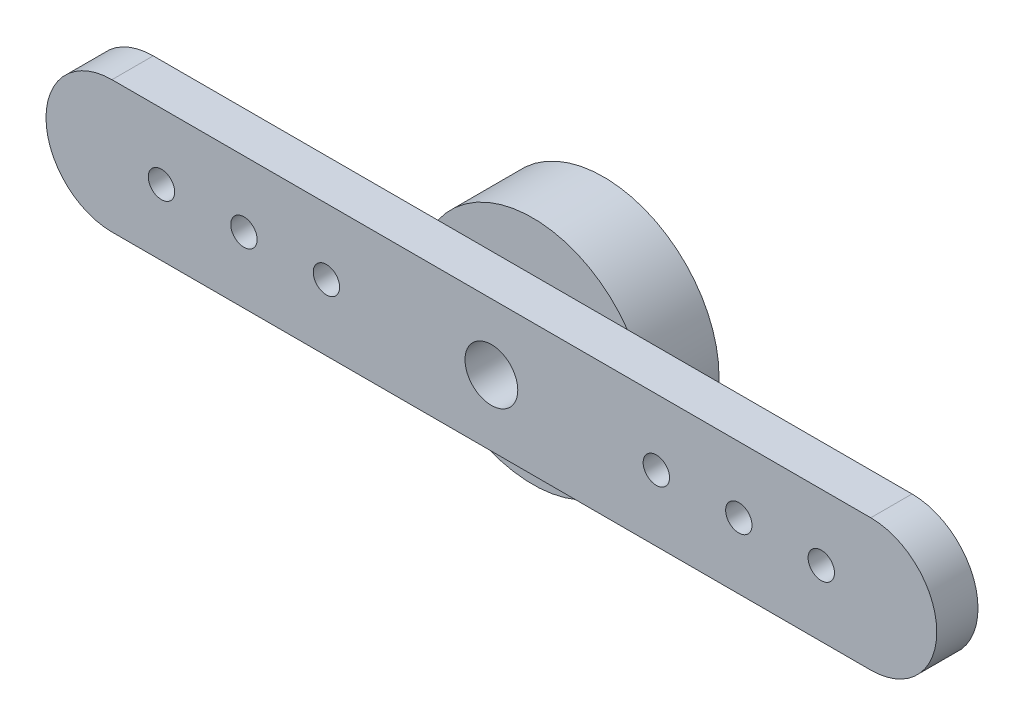
ISO-10303-21;
HEADER;
FILE_DESCRIPTION(('STEP AP214'),'2;1');
FILE_NAME('part.step','',(''),(''),'','','');
FILE_SCHEMA(('AUTOMOTIVE_DESIGN { 1 0 10303 214 1 1 1 1 }'));
ENDSEC;
DATA;
#1=APPLICATION_CONTEXT('core data for automotive mechanical design processes');
#2=APPLICATION_PROTOCOL_DEFINITION('international standard','automotive_design',2000,#1);
#3=PRODUCT_CONTEXT('',#1,'mechanical');
#4=PRODUCT('Part','Part','',(#3));
#5=PRODUCT_RELATED_PRODUCT_CATEGORY('part','',(#4));
#6=PRODUCT_DEFINITION_FORMATION('','',#4);
#7=PRODUCT_DEFINITION_CONTEXT('part definition',#1,'design');
#8=PRODUCT_DEFINITION('design','',#6,#7);
#9=PRODUCT_DEFINITION_SHAPE('','',#8);
#10=(LENGTH_UNIT() NAMED_UNIT(*) SI_UNIT(.MILLI.,.METRE.));
#11=(NAMED_UNIT(*) PLANE_ANGLE_UNIT() SI_UNIT($,.RADIAN.));
#12=(NAMED_UNIT(*) SI_UNIT($,.STERADIAN.) SOLID_ANGLE_UNIT());
#13=UNCERTAINTY_MEASURE_WITH_UNIT(LENGTH_MEASURE(1.E-05),#10,'distance_accuracy_value','');
#14=(GEOMETRIC_REPRESENTATION_CONTEXT(3) GLOBAL_UNCERTAINTY_ASSIGNED_CONTEXT((#13)) GLOBAL_UNIT_ASSIGNED_CONTEXT((#10,
#11,#12)) REPRESENTATION_CONTEXT('',''));
#15=CARTESIAN_POINT('',(0.,0.,0.));
#16=DIRECTION('',(0.,0.,1.));
#17=DIRECTION('',(1.,0.,0.));
#18=AXIS2_PLACEMENT_3D('',#15,#16,#17);
#19=CARTESIAN_POINT('',(0.,0.,6.5));
#20=DIRECTION('',(0.,0.,1.));
#21=DIRECTION('',(1.,0.,0.));
#22=AXIS2_PLACEMENT_3D('',#19,#20,#21);
#23=PLANE('',#22);
#24=DIRECTION('',(-1.,0.,0.));
#25=VECTOR('',#24,1.);
#26=CARTESIAN_POINT('',(-23.,4.,6.5));
#27=LINE('',#26,#25);
#28=CARTESIAN_POINT('',(5.74456264653803,4.,6.5));
#29=VERTEX_POINT('',#28);
#30=CARTESIAN_POINT('',(-5.74456264653803,4.,6.5));
#31=VERTEX_POINT('',#30);
#32=EDGE_CURVE('E11',#29,#31,#27,.T.);
#33=ORIENTED_EDGE('',*,*,#32,.F.);
#34=CARTESIAN_POINT('',(0.,0.,6.5));
#35=DIRECTION('',(0.,0.,1.));
#36=DIRECTION('',(1.,0.,0.));
#37=AXIS2_PLACEMENT_3D('',#34,#35,#36);
#38=CIRCLE('',#37,7.);
#39=EDGE_CURVE('E135',#29,#31,#38,.T.);
#40=ORIENTED_EDGE('',*,*,#39,.T.);
#41=EDGE_LOOP('',(#33,#40));
#42=FACE_BOUND('',#41,.T.);
#43=ADVANCED_FACE('F39',(#42),#23,.T.);
#44=DIRECTION('',(1.,0.,0.));
#45=VECTOR('',#44,1.);
#46=CARTESIAN_POINT('',(23.,-4.,6.5));
#47=LINE('',#46,#45);
#48=CARTESIAN_POINT('',(-5.74456264653803,-4.,6.5));
#49=VERTEX_POINT('',#48);
#50=CARTESIAN_POINT('',(5.74456264653803,-4.,6.5));
#51=VERTEX_POINT('',#50);
#52=EDGE_CURVE('E48',#49,#51,#47,.T.);
#53=ORIENTED_EDGE('',*,*,#52,.F.);
#54=EDGE_CURVE('E137',#49,#51,#38,.T.);
#55=ORIENTED_EDGE('',*,*,#54,.T.);
#56=EDGE_LOOP('',(#53,#55));
#57=FACE_BOUND('',#56,.T.);
#58=ADVANCED_FACE('F151',(#57),#23,.T.);
#59=CARTESIAN_POINT('',(0.,0.,2.2));
#60=DIRECTION('',(0.,0.,1.));
#61=DIRECTION('',(1.,0.,0.));
#62=AXIS2_PLACEMENT_3D('',#59,#60,#61);
#63=PLANE('',#62);
#64=CARTESIAN_POINT('',(0.,0.,2.2));
#65=DIRECTION('',(0.,0.,1.));
#66=DIRECTION('',(1.,0.,0.));
#67=AXIS2_PLACEMENT_3D('',#64,#65,#66);
#68=CIRCLE('',#67,7.);
#69=CARTESIAN_POINT('',(7.,0.,2.2));
#70=VERTEX_POINT('',#69);
#71=EDGE_CURVE('E43',#70,#70,#68,.T.);
#72=ORIENTED_EDGE('',*,*,#71,.F.);
#73=EDGE_LOOP('',(#72));
#74=FACE_BOUND('',#73,.T.);
#75=CARTESIAN_POINT('',(0.,0.,2.2));
#76=DIRECTION('',(0.,0.,1.));
#77=DIRECTION('',(1.,0.,0.));
#78=AXIS2_PLACEMENT_3D('',#75,#76,#77);
#79=CIRCLE('',#78,3.05);
#80=CARTESIAN_POINT('',(-3.05,0.,2.2));
#81=VERTEX_POINT('',#80);
#82=EDGE_CURVE('E124',#81,#81,#79,.T.);
#83=ORIENTED_EDGE('',*,*,#82,.T.);
#84=EDGE_LOOP('',(#83));
#85=FACE_BOUND('',#84,.T.);
#86=ADVANCED_FACE('F148',(#74,#85),#63,.F.);
#87=CARTESIAN_POINT('',(0.,0.,6.5));
#88=DIRECTION('',(0.,0.,-1.));
#89=DIRECTION('',(-1.,0.,0.));
#90=AXIS2_PLACEMENT_3D('',#87,#88,#89);
#91=CYLINDRICAL_SURFACE('',#90,7.);
#92=ORIENTED_EDGE('',*,*,#39,.F.);
#93=EDGE_CURVE('E133',#51,#29,#38,.T.);
#94=ORIENTED_EDGE('',*,*,#93,.F.);
#95=ORIENTED_EDGE('',*,*,#54,.F.);
#96=EDGE_CURVE('E61',#31,#49,#38,.T.);
#97=ORIENTED_EDGE('',*,*,#96,.F.);
#98=EDGE_LOOP('',(#92,#94,#95,#97));
#99=FACE_BOUND('',#98,.T.);
#100=ORIENTED_EDGE('',*,*,#71,.T.);
#101=EDGE_LOOP('',(#100));
#102=FACE_BOUND('',#101,.T.);
#103=ADVANCED_FACE('F41',(#99,#102),#91,.T.);
#104=CARTESIAN_POINT('',(0.,0.,6.5));
#105=DIRECTION('',(0.,0.,-1.));
#106=DIRECTION('',(-1.,0.,0.));
#107=AXIS2_PLACEMENT_3D('',#104,#105,#106);
#108=CYLINDRICAL_SURFACE('',#107,3.05);
#109=CARTESIAN_POINT('',(0.,0.,6.5));
#110=DIRECTION('',(0.,0.,1.));
#111=DIRECTION('',(1.,0.,0.));
#112=AXIS2_PLACEMENT_3D('',#109,#110,#111);
#113=CIRCLE('',#112,3.05);
#114=CARTESIAN_POINT('',(-3.05,0.,6.5));
#115=VERTEX_POINT('',#114);
#116=EDGE_CURVE('E122',#115,#115,#113,.T.);
#117=CARTESIAN_POINT('',(-3.05,0.,6.5));
#118=CARTESIAN_POINT('',(-3.05,0.,6.45520833333333));
#119=CARTESIAN_POINT('',(-3.05,0.,6.41041666666667));
#120=CARTESIAN_POINT('',(-3.05,0.,6.32083333333333));
#121=CARTESIAN_POINT('',(-3.05,0.,6.27604166666667));
#122=CARTESIAN_POINT('',(-3.05,0.,6.18645833333333));
#123=CARTESIAN_POINT('',(-3.05,0.,6.14166666666667));
#124=CARTESIAN_POINT('',(-3.05,0.,6.05208333333333));
#125=CARTESIAN_POINT('',(-3.05,0.,6.00729166666667));
#126=CARTESIAN_POINT('',(-3.05,0.,5.91770833333333));
#127=CARTESIAN_POINT('',(-3.05,0.,5.87291666666667));
#128=CARTESIAN_POINT('',(-3.05,0.,5.78333333333333));
#129=CARTESIAN_POINT('',(-3.05,0.,5.73854166666667));
#130=CARTESIAN_POINT('',(-3.05,0.,5.64895833333333));
#131=CARTESIAN_POINT('',(-3.05,0.,5.60416666666667));
#132=CARTESIAN_POINT('',(-3.05,0.,5.51458333333333));
#133=CARTESIAN_POINT('',(-3.05,0.,5.46979166666667));
#134=CARTESIAN_POINT('',(-3.05,0.,5.38020833333333));
#135=CARTESIAN_POINT('',(-3.05,0.,5.33541666666667));
#136=CARTESIAN_POINT('',(-3.05,0.,5.24583333333333));
#137=CARTESIAN_POINT('',(-3.05,0.,5.20104166666667));
#138=CARTESIAN_POINT('',(-3.05,0.,5.11145833333333));
#139=CARTESIAN_POINT('',(-3.05,0.,5.06666666666667));
#140=CARTESIAN_POINT('',(-3.05,0.,4.97708333333333));
#141=CARTESIAN_POINT('',(-3.05,0.,4.93229166666667));
#142=CARTESIAN_POINT('',(-3.05,0.,4.84270833333333));
#143=CARTESIAN_POINT('',(-3.05,0.,4.79791666666667));
#144=CARTESIAN_POINT('',(-3.05,0.,4.70833333333333));
#145=CARTESIAN_POINT('',(-3.05,0.,4.66354166666667));
#146=CARTESIAN_POINT('',(-3.05,0.,4.57395833333333));
#147=CARTESIAN_POINT('',(-3.05,0.,4.52916666666667));
#148=CARTESIAN_POINT('',(-3.05,0.,4.43958333333333));
#149=CARTESIAN_POINT('',(-3.05,0.,4.39479166666667));
#150=CARTESIAN_POINT('',(-3.05,0.,4.30520833333333));
#151=CARTESIAN_POINT('',(-3.05,0.,4.26041666666667));
#152=CARTESIAN_POINT('',(-3.05,0.,4.17083333333333));
#153=CARTESIAN_POINT('',(-3.05,0.,4.12604166666667));
#154=CARTESIAN_POINT('',(-3.05,0.,4.03645833333333));
#155=CARTESIAN_POINT('',(-3.05,0.,3.99166666666667));
#156=CARTESIAN_POINT('',(-3.05,0.,3.90208333333333));
#157=CARTESIAN_POINT('',(-3.05,0.,3.85729166666667));
#158=CARTESIAN_POINT('',(-3.05,0.,3.76770833333333));
#159=CARTESIAN_POINT('',(-3.05,0.,3.72291666666667));
#160=CARTESIAN_POINT('',(-3.05,0.,3.63333333333333));
#161=CARTESIAN_POINT('',(-3.05,0.,3.58854166666667));
#162=CARTESIAN_POINT('',(-3.05,0.,3.49895833333333));
#163=CARTESIAN_POINT('',(-3.05,0.,3.45416666666667));
#164=CARTESIAN_POINT('',(-3.05,0.,3.36458333333333));
#165=CARTESIAN_POINT('',(-3.05,0.,3.31979166666667));
#166=CARTESIAN_POINT('',(-3.05,0.,3.23020833333333));
#167=CARTESIAN_POINT('',(-3.05,0.,3.18541666666667));
#168=CARTESIAN_POINT('',(-3.05,0.,3.09583333333333));
#169=CARTESIAN_POINT('',(-3.05,0.,3.05104166666667));
#170=CARTESIAN_POINT('',(-3.05,0.,2.96145833333333));
#171=CARTESIAN_POINT('',(-3.05,0.,2.91666666666667));
#172=CARTESIAN_POINT('',(-3.05,0.,2.82708333333333));
#173=CARTESIAN_POINT('',(-3.05,0.,2.78229166666667));
#174=CARTESIAN_POINT('',(-3.05,0.,2.69270833333333));
#175=CARTESIAN_POINT('',(-3.05,0.,2.64791666666667));
#176=CARTESIAN_POINT('',(-3.05,0.,2.55833333333333));
#177=CARTESIAN_POINT('',(-3.05,0.,2.51354166666667));
#178=CARTESIAN_POINT('',(-3.05,0.,2.42395833333333));
#179=CARTESIAN_POINT('',(-3.05,0.,2.37916666666667));
#180=CARTESIAN_POINT('',(-3.05,0.,2.28958333333333));
#181=CARTESIAN_POINT('',(-3.05,0.,2.24479166666667));
#182=CARTESIAN_POINT('',(-3.05,0.,2.2));
#183=B_SPLINE_CURVE_WITH_KNOTS('',3,(#117,#118,#119,#120,#121,#122,#123,#124,#125,#126,#127,
#128,#129,#130,#131,#132,#133,#134,#135,#136,#137,#138,#139,#140,#141,#142,#143,#144,#145,#146,
#147,#148,#149,#150,#151,#152,#153,#154,#155,#156,#157,#158,#159,#160,#161,#162,#163,#164,#165,
#166,#167,#168,#169,#170,#171,#172,#173,#174,#175,#176,#177,#178,#179,#180,#181,#182),
.UNSPECIFIED.,.F.,.F.,(4,2,2,2,2,2,2,2,2,2,2,2,2,2,2,2,2,2,2,2,2,2,2,2,2,2,2,2,2,2,2,2,4),(0.,
0.134375000000001,0.268750000000001,0.403125000000001,0.537500000000001,0.671875000000001,
0.806250000000001,0.940625,1.075,1.209375,1.34375,1.478125,1.6125,1.746875,1.88125,2.015625,
2.15,2.284375,2.41875,2.553125,2.6875,2.821875,2.95625,3.090625,3.225,3.359375,3.49375,3.628125,
3.7625,3.896875,4.03125,4.165625,4.3),.UNSPECIFIED.);
#184=EDGE_CURVE('BSEAM157',#115,#81,#183,.T.);
#185=ORIENTED_EDGE('',*,*,#116,.T.);
#186=ORIENTED_EDGE('',*,*,#82,.F.);
#187=ORIENTED_EDGE('',*,*,#184,.T.);
#188=ORIENTED_EDGE('',*,*,#184,.F.);
#189=EDGE_LOOP('',(#185,#187,#186,#188));
#190=FACE_BOUND('',#189,.T.);
#191=ADVANCED_FACE('F157',(#190),#108,.F.);
#192=CARTESIAN_POINT('',(-23.,0.,6.5));
#193=DIRECTION('',(0.,0.,-1.));
#194=DIRECTION('',(-1.,0.,0.));
#195=AXIS2_PLACEMENT_3D('',#192,#193,#194);
#196=PLANE('',#195);
#197=CARTESIAN_POINT('',(-15.,0.,6.5));
#198=DIRECTION('',(0.,0.,1.));
#199=DIRECTION('',(1.,0.,0.));
#200=AXIS2_PLACEMENT_3D('',#197,#198,#199);
#201=CIRCLE('',#200,0.8);
#202=CARTESIAN_POINT('',(-14.2,0.,6.5));
#203=VERTEX_POINT('',#202);
#204=EDGE_CURVE('E203',#203,#203,#201,.T.);
#205=ORIENTED_EDGE('',*,*,#204,.T.);
#206=EDGE_LOOP('',(#205));
#207=FACE_BOUND('',#206,.T.);
#208=CARTESIAN_POINT('',(-10.,0.,6.5));
#209=DIRECTION('',(0.,0.,1.));
#210=DIRECTION('',(1.,0.,0.));
#211=AXIS2_PLACEMENT_3D('',#208,#209,#210);
#212=CIRCLE('',#211,0.8);
#213=CARTESIAN_POINT('',(-9.2,0.,6.5));
#214=VERTEX_POINT('',#213);
#215=EDGE_CURVE('E197',#214,#214,#212,.T.);
#216=ORIENTED_EDGE('',*,*,#215,.T.);
#217=EDGE_LOOP('',(#216));
#218=FACE_BOUND('',#217,.T.);
#219=CARTESIAN_POINT('',(-20.,0.,6.5));
#220=DIRECTION('',(0.,0.,1.));
#221=DIRECTION('',(1.,0.,0.));
#222=AXIS2_PLACEMENT_3D('',#219,#220,#221);
#223=CIRCLE('',#222,0.799999999999999);
#224=CARTESIAN_POINT('',(-19.2,0.,6.5));
#225=VERTEX_POINT('',#224);
#226=EDGE_CURVE('E213',#225,#225,#223,.T.);
#227=ORIENTED_EDGE('',*,*,#226,.T.);
#228=EDGE_LOOP('',(#227));
#229=FACE_BOUND('',#228,.T.);
#230=CARTESIAN_POINT('',(-23.,4.,6.5));
#231=VERTEX_POINT('',#230);
#232=EDGE_CURVE('E51',#31,#231,#27,.T.);
#233=ORIENTED_EDGE('',*,*,#232,.F.);
#234=ORIENTED_EDGE('',*,*,#96,.T.);
#235=CARTESIAN_POINT('',(-23.,-4.,6.5));
#236=VERTEX_POINT('',#235);
#237=EDGE_CURVE('E140',#236,#49,#47,.T.);
#238=ORIENTED_EDGE('',*,*,#237,.F.);
#239=CARTESIAN_POINT('',(-23.,0.,6.5));
#240=DIRECTION('',(0.,0.,1.));
#241=DIRECTION('',(-1.,0.,0.));
#242=AXIS2_PLACEMENT_3D('',#239,#240,#241);
#243=CIRCLE('',#242,4.);
#244=EDGE_CURVE('E123',#231,#236,#243,.T.);
#245=ORIENTED_EDGE('',*,*,#244,.F.);
#246=EDGE_LOOP('',(#233,#234,#238,#245));
#247=FACE_BOUND('',#246,.T.);
#248=ADVANCED_FACE('F156',(#207,#218,#229,#247),#196,.T.);
#249=CARTESIAN_POINT('',(0.,0.,6.5));
#250=DIRECTION('',(0.,0.,1.));
#251=DIRECTION('',(1.,0.,0.));
#252=AXIS2_PLACEMENT_3D('',#249,#250,#251);
#253=CIRCLE('',#252,1.6);
#254=CARTESIAN_POINT('',(1.6,0.,6.5));
#255=VERTEX_POINT('',#254);
#256=EDGE_CURVE('E195',#255,#255,#253,.T.);
#257=ORIENTED_EDGE('',*,*,#256,.T.);
#258=EDGE_LOOP('',(#257));
#259=FACE_BOUND('',#258,.T.);
#260=ORIENTED_EDGE('',*,*,#116,.F.);
#261=EDGE_LOOP('',(#260));
#262=FACE_BOUND('',#261,.T.);
#263=ADVANCED_FACE('F164',(#259,#262),#196,.T.);
#264=CARTESIAN_POINT('',(-23.,0.,9.));
#265=DIRECTION('',(0.,0.,-1.));
#266=DIRECTION('',(-1.,0.,0.));
#267=AXIS2_PLACEMENT_3D('',#264,#265,#266);
#268=PLANE('',#267);
#269=CARTESIAN_POINT('',(-23.,0.,9.));
#270=DIRECTION('',(0.,0.,1.));
#271=DIRECTION('',(-1.,0.,0.));
#272=AXIS2_PLACEMENT_3D('',#269,#270,#271);
#273=CIRCLE('',#272,4.);
#274=CARTESIAN_POINT('',(-23.,4.,9.));
#275=VERTEX_POINT('',#274);
#276=CARTESIAN_POINT('',(-23.,-4.,9.));
#277=VERTEX_POINT('',#276);
#278=EDGE_CURVE('E106',#275,#277,#273,.T.);
#279=ORIENTED_EDGE('',*,*,#278,.T.);
#280=DIRECTION('',(1.,0.,0.));
#281=VECTOR('',#280,1.);
#282=CARTESIAN_POINT('',(23.,-4.,9.));
#283=LINE('',#282,#281);
#284=CARTESIAN_POINT('',(23.,-4.,9.));
#285=VERTEX_POINT('',#284);
#286=EDGE_CURVE('E96',#277,#285,#283,.T.);
#287=ORIENTED_EDGE('',*,*,#286,.T.);
#288=CARTESIAN_POINT('',(23.,0.,9.));
#289=DIRECTION('',(0.,0.,1.));
#290=DIRECTION('',(-1.,0.,0.));
#291=AXIS2_PLACEMENT_3D('',#288,#289,#290);
#292=CIRCLE('',#291,4.);
#293=CARTESIAN_POINT('',(23.,4.,9.));
#294=VERTEX_POINT('',#293);
#295=EDGE_CURVE('E110',#285,#294,#292,.T.);
#296=ORIENTED_EDGE('',*,*,#295,.T.);
#297=DIRECTION('',(-1.,0.,0.));
#298=VECTOR('',#297,1.);
#299=CARTESIAN_POINT('',(-23.,4.,9.));
#300=LINE('',#299,#298);
#301=EDGE_CURVE('E114',#294,#275,#300,.T.);
#302=ORIENTED_EDGE('',*,*,#301,.T.);
#303=EDGE_LOOP('',(#279,#287,#296,#302));
#304=FACE_BOUND('',#303,.T.);
#305=CARTESIAN_POINT('',(0.,0.,9.));
#306=DIRECTION('',(0.,0.,1.));
#307=DIRECTION('',(1.,0.,0.));
#308=AXIS2_PLACEMENT_3D('',#305,#306,#307);
#309=CIRCLE('',#308,1.6);
#310=CARTESIAN_POINT('',(1.6,0.,9.));
#311=VERTEX_POINT('',#310);
#312=EDGE_CURVE('E193',#311,#311,#309,.T.);
#313=ORIENTED_EDGE('',*,*,#312,.F.);
#314=EDGE_LOOP('',(#313));
#315=FACE_BOUND('',#314,.T.);
#316=CARTESIAN_POINT('',(-10.,0.,9.));
#317=DIRECTION('',(0.,0.,1.));
#318=DIRECTION('',(1.,0.,0.));
#319=AXIS2_PLACEMENT_3D('',#316,#317,#318);
#320=CIRCLE('',#319,0.8);
#321=CARTESIAN_POINT('',(-9.2,0.,9.));
#322=VERTEX_POINT('',#321);
#323=EDGE_CURVE('E198',#322,#322,#320,.T.);
#324=ORIENTED_EDGE('',*,*,#323,.F.);
#325=EDGE_LOOP('',(#324));
#326=FACE_BOUND('',#325,.T.);
#327=CARTESIAN_POINT('',(-15.,0.,9.));
#328=DIRECTION('',(0.,0.,1.));
#329=DIRECTION('',(1.,0.,0.));
#330=AXIS2_PLACEMENT_3D('',#327,#328,#329);
#331=CIRCLE('',#330,0.8);
#332=CARTESIAN_POINT('',(-14.2,0.,9.));
#333=VERTEX_POINT('',#332);
#334=EDGE_CURVE('E205',#333,#333,#331,.T.);
#335=ORIENTED_EDGE('',*,*,#334,.F.);
#336=EDGE_LOOP('',(#335));
#337=FACE_BOUND('',#336,.T.);
#338=CARTESIAN_POINT('',(-20.,0.,9.));
#339=DIRECTION('',(0.,0.,1.));
#340=DIRECTION('',(1.,0.,0.));
#341=AXIS2_PLACEMENT_3D('',#338,#339,#340);
#342=CIRCLE('',#341,0.799999999999999);
#343=CARTESIAN_POINT('',(-19.2,0.,9.));
#344=VERTEX_POINT('',#343);
#345=EDGE_CURVE('E206',#344,#344,#342,.T.);
#346=ORIENTED_EDGE('',*,*,#345,.F.);
#347=EDGE_LOOP('',(#346));
#348=FACE_BOUND('',#347,.T.);
#349=CARTESIAN_POINT('',(10.,0.,9.));
#350=DIRECTION('',(0.,0.,1.));
#351=DIRECTION('',(1.,0.,0.));
#352=AXIS2_PLACEMENT_3D('',#349,#350,#351);
#353=CIRCLE('',#352,0.8);
#354=CARTESIAN_POINT('',(10.8,0.,9.));
#355=VERTEX_POINT('',#354);
#356=EDGE_CURVE('E215',#355,#355,#353,.T.);
#357=ORIENTED_EDGE('',*,*,#356,.F.);
#358=EDGE_LOOP('',(#357));
#359=FACE_BOUND('',#358,.T.);
#360=CARTESIAN_POINT('',(15.,0.,9.));
#361=DIRECTION('',(0.,0.,1.));
#362=DIRECTION('',(1.,0.,0.));
#363=AXIS2_PLACEMENT_3D('',#360,#361,#362);
#364=CIRCLE('',#363,0.799999999999999);
#365=CARTESIAN_POINT('',(15.8,0.,9.));
#366=VERTEX_POINT('',#365);
#367=EDGE_CURVE('E217',#366,#366,#364,.T.);
#368=ORIENTED_EDGE('',*,*,#367,.F.);
#369=EDGE_LOOP('',(#368));
#370=FACE_BOUND('',#369,.T.);
#371=CARTESIAN_POINT('',(20.,0.,9.));
#372=DIRECTION('',(0.,0.,1.));
#373=DIRECTION('',(1.,0.,0.));
#374=AXIS2_PLACEMENT_3D('',#371,#372,#373);
#375=CIRCLE('',#374,0.799999999999999);
#376=CARTESIAN_POINT('',(20.8,0.,9.));
#377=VERTEX_POINT('',#376);
#378=EDGE_CURVE('E226',#377,#377,#375,.T.);
#379=ORIENTED_EDGE('',*,*,#378,.F.);
#380=EDGE_LOOP('',(#379));
#381=FACE_BOUND('',#380,.T.);
#382=ADVANCED_FACE('F112',(#304,#315,#326,#337,#348,#359,#370,#381),#268,.F.);
#383=CARTESIAN_POINT('',(15.,0.,6.5));
#384=DIRECTION('',(0.,0.,1.));
#385=DIRECTION('',(1.,0.,0.));
#386=AXIS2_PLACEMENT_3D('',#383,#384,#385);
#387=CIRCLE('',#386,0.799999999999999);
#388=CARTESIAN_POINT('',(15.8,0.,6.5));
#389=VERTEX_POINT('',#388);
#390=EDGE_CURVE('E223',#389,#389,#387,.T.);
#391=ORIENTED_EDGE('',*,*,#390,.T.);
#392=EDGE_LOOP('',(#391));
#393=FACE_BOUND('',#392,.T.);
#394=CARTESIAN_POINT('',(23.,-4.,6.5));
#395=VERTEX_POINT('',#394);
#396=EDGE_CURVE('E138',#51,#395,#47,.T.);
#397=ORIENTED_EDGE('',*,*,#396,.F.);
#398=ORIENTED_EDGE('',*,*,#93,.T.);
#399=CARTESIAN_POINT('',(23.,4.,6.5));
#400=VERTEX_POINT('',#399);
#401=EDGE_CURVE('E49',#400,#29,#27,.T.);
#402=ORIENTED_EDGE('',*,*,#401,.F.);
#403=CARTESIAN_POINT('',(23.,0.,6.5));
#404=DIRECTION('',(0.,0.,1.));
#405=DIRECTION('',(-1.,0.,0.));
#406=AXIS2_PLACEMENT_3D('',#403,#404,#405);
#407=CIRCLE('',#406,4.);
#408=EDGE_CURVE('E178',#395,#400,#407,.T.);
#409=ORIENTED_EDGE('',*,*,#408,.F.);
#410=EDGE_LOOP('',(#397,#398,#402,#409));
#411=FACE_BOUND('',#410,.T.);
#412=CARTESIAN_POINT('',(10.,0.,6.5));
#413=DIRECTION('',(0.,0.,1.));
#414=DIRECTION('',(1.,0.,0.));
#415=AXIS2_PLACEMENT_3D('',#412,#413,#414);
#416=CIRCLE('',#415,0.8);
#417=CARTESIAN_POINT('',(10.8,0.,6.5));
#418=VERTEX_POINT('',#417);
#419=EDGE_CURVE('E220',#418,#418,#416,.T.);
#420=ORIENTED_EDGE('',*,*,#419,.T.);
#421=EDGE_LOOP('',(#420));
#422=FACE_BOUND('',#421,.T.);
#423=CARTESIAN_POINT('',(20.,0.,6.5));
#424=DIRECTION('',(0.,0.,1.));
#425=DIRECTION('',(1.,0.,0.));
#426=AXIS2_PLACEMENT_3D('',#423,#424,#425);
#427=CIRCLE('',#426,0.799999999999999);
#428=CARTESIAN_POINT('',(20.8,0.,6.5));
#429=VERTEX_POINT('',#428);
#430=EDGE_CURVE('E227',#429,#429,#427,.T.);
#431=ORIENTED_EDGE('',*,*,#430,.T.);
#432=EDGE_LOOP('',(#431));
#433=FACE_BOUND('',#432,.T.);
#434=ADVANCED_FACE('F166',(#393,#411,#422,#433),#196,.T.);
#435=CARTESIAN_POINT('',(-23.,0.,9.));
#436=DIRECTION('',(0.,0.,-1.));
#437=DIRECTION('',(-1.,0.,0.));
#438=AXIS2_PLACEMENT_3D('',#435,#436,#437);
#439=CYLINDRICAL_SURFACE('',#438,4.);
#440=ORIENTED_EDGE('',*,*,#244,.T.);
#441=DIRECTION('',(0.,0.,-1.));
#442=VECTOR('',#441,1.);
#443=CARTESIAN_POINT('',(-23.,-4.,9.));
#444=LINE('',#443,#442);
#445=EDGE_CURVE('E102',#277,#236,#444,.T.);
#446=ORIENTED_EDGE('',*,*,#445,.F.);
#447=ORIENTED_EDGE('',*,*,#278,.F.);
#448=DIRECTION('',(0.,0.,-1.));
#449=VECTOR('',#448,1.);
#450=CARTESIAN_POINT('',(-23.,4.,9.));
#451=LINE('',#450,#449);
#452=EDGE_CURVE('E182',#275,#231,#451,.T.);
#453=ORIENTED_EDGE('',*,*,#452,.T.);
#454=EDGE_LOOP('',(#440,#446,#447,#453));
#455=FACE_BOUND('',#454,.T.);
#456=ADVANCED_FACE('F117',(#455),#439,.T.);
#457=CARTESIAN_POINT('',(23.,-4.,9.));
#458=DIRECTION('',(0.,1.,0.));
#459=DIRECTION('',(0.,0.,1.));
#460=AXIS2_PLACEMENT_3D('',#457,#458,#459);
#461=PLANE('',#460);
#462=ORIENTED_EDGE('',*,*,#237,.T.);
#463=ORIENTED_EDGE('',*,*,#52,.T.);
#464=ORIENTED_EDGE('',*,*,#396,.T.);
#465=DIRECTION('',(0.,0.,-1.));
#466=VECTOR('',#465,1.);
#467=CARTESIAN_POINT('',(23.,-4.,9.));
#468=LINE('',#467,#466);
#469=EDGE_CURVE('E101',#285,#395,#468,.T.);
#470=ORIENTED_EDGE('',*,*,#469,.F.);
#471=ORIENTED_EDGE('',*,*,#286,.F.);
#472=ORIENTED_EDGE('',*,*,#445,.T.);
#473=EDGE_LOOP('',(#462,#463,#464,#470,#471,#472));
#474=FACE_BOUND('',#473,.T.);
#475=ADVANCED_FACE('F98',(#474),#461,.F.);
#476=CARTESIAN_POINT('',(23.,0.,9.));
#477=DIRECTION('',(0.,0.,-1.));
#478=DIRECTION('',(-1.,0.,0.));
#479=AXIS2_PLACEMENT_3D('',#476,#477,#478);
#480=CYLINDRICAL_SURFACE('',#479,4.);
#481=ORIENTED_EDGE('',*,*,#408,.T.);
#482=DIRECTION('',(0.,0.,-1.));
#483=VECTOR('',#482,1.);
#484=CARTESIAN_POINT('',(23.,4.,9.));
#485=LINE('',#484,#483);
#486=EDGE_CURVE('E130',#294,#400,#485,.T.);
#487=ORIENTED_EDGE('',*,*,#486,.F.);
#488=ORIENTED_EDGE('',*,*,#295,.F.);
#489=ORIENTED_EDGE('',*,*,#469,.T.);
#490=EDGE_LOOP('',(#481,#487,#488,#489));
#491=FACE_BOUND('',#490,.T.);
#492=ADVANCED_FACE('F188',(#491),#480,.T.);
#493=CARTESIAN_POINT('',(-23.,4.,9.));
#494=DIRECTION('',(0.,-1.,0.));
#495=DIRECTION('',(0.,0.,-1.));
#496=AXIS2_PLACEMENT_3D('',#493,#494,#495);
#497=PLANE('',#496);
#498=ORIENTED_EDGE('',*,*,#401,.T.);
#499=ORIENTED_EDGE('',*,*,#32,.T.);
#500=ORIENTED_EDGE('',*,*,#232,.T.);
#501=ORIENTED_EDGE('',*,*,#452,.F.);
#502=ORIENTED_EDGE('',*,*,#301,.F.);
#503=ORIENTED_EDGE('',*,*,#486,.T.);
#504=EDGE_LOOP('',(#498,#499,#500,#501,#502,#503));
#505=FACE_BOUND('',#504,.T.);
#506=ADVANCED_FACE('F190',(#505),#497,.F.);
#507=CARTESIAN_POINT('',(0.,0.,9.));
#508=DIRECTION('',(0.,0.,-1.));
#509=DIRECTION('',(-1.,0.,0.));
#510=AXIS2_PLACEMENT_3D('',#507,#508,#509);
#511=CYLINDRICAL_SURFACE('',#510,1.6);
#512=ORIENTED_EDGE('',*,*,#312,.T.);
#513=EDGE_LOOP('',(#512));
#514=FACE_BOUND('',#513,.T.);
#515=ORIENTED_EDGE('',*,*,#256,.F.);
#516=EDGE_LOOP('',(#515));
#517=FACE_BOUND('',#516,.T.);
#518=ADVANCED_FACE('F250',(#514,#517),#511,.F.);
#519=CARTESIAN_POINT('',(-10.,0.,9.));
#520=DIRECTION('',(0.,0.,-1.));
#521=DIRECTION('',(-1.,0.,0.));
#522=AXIS2_PLACEMENT_3D('',#519,#520,#521);
#523=CYLINDRICAL_SURFACE('',#522,0.8);
#524=ORIENTED_EDGE('',*,*,#323,.T.);
#525=EDGE_LOOP('',(#524));
#526=FACE_BOUND('',#525,.T.);
#527=ORIENTED_EDGE('',*,*,#215,.F.);
#528=EDGE_LOOP('',(#527));
#529=FACE_BOUND('',#528,.T.);
#530=ADVANCED_FACE('F285',(#526,#529),#523,.F.);
#531=CARTESIAN_POINT('',(-15.,0.,9.));
#532=DIRECTION('',(0.,0.,-1.));
#533=DIRECTION('',(-1.,0.,0.));
#534=AXIS2_PLACEMENT_3D('',#531,#532,#533);
#535=CYLINDRICAL_SURFACE('',#534,0.8);
#536=ORIENTED_EDGE('',*,*,#334,.T.);
#537=EDGE_LOOP('',(#536));
#538=FACE_BOUND('',#537,.T.);
#539=ORIENTED_EDGE('',*,*,#204,.F.);
#540=EDGE_LOOP('',(#539));
#541=FACE_BOUND('',#540,.T.);
#542=ADVANCED_FACE('F289',(#538,#541),#535,.F.);
#543=CARTESIAN_POINT('',(-20.,0.,9.));
#544=DIRECTION('',(0.,0.,-1.));
#545=DIRECTION('',(-1.,0.,0.));
#546=AXIS2_PLACEMENT_3D('',#543,#544,#545);
#547=CYLINDRICAL_SURFACE('',#546,0.799999999999999);
#548=ORIENTED_EDGE('',*,*,#345,.T.);
#549=EDGE_LOOP('',(#548));
#550=FACE_BOUND('',#549,.T.);
#551=ORIENTED_EDGE('',*,*,#226,.F.);
#552=EDGE_LOOP('',(#551));
#553=FACE_BOUND('',#552,.T.);
#554=ADVANCED_FACE('F296',(#550,#553),#547,.F.);
#555=CARTESIAN_POINT('',(10.,0.,9.));
#556=DIRECTION('',(0.,0.,-1.));
#557=DIRECTION('',(-1.,0.,0.));
#558=AXIS2_PLACEMENT_3D('',#555,#556,#557);
#559=CYLINDRICAL_SURFACE('',#558,0.8);
#560=ORIENTED_EDGE('',*,*,#356,.T.);
#561=EDGE_LOOP('',(#560));
#562=FACE_BOUND('',#561,.T.);
#563=ORIENTED_EDGE('',*,*,#419,.F.);
#564=EDGE_LOOP('',(#563));
#565=FACE_BOUND('',#564,.T.);
#566=ADVANCED_FACE('F310',(#562,#565),#559,.F.);
#567=CARTESIAN_POINT('',(15.,0.,9.));
#568=DIRECTION('',(0.,0.,-1.));
#569=DIRECTION('',(-1.,0.,0.));
#570=AXIS2_PLACEMENT_3D('',#567,#568,#569);
#571=CYLINDRICAL_SURFACE('',#570,0.799999999999999);
#572=ORIENTED_EDGE('',*,*,#367,.T.);
#573=EDGE_LOOP('',(#572));
#574=FACE_BOUND('',#573,.T.);
#575=ORIENTED_EDGE('',*,*,#390,.F.);
#576=EDGE_LOOP('',(#575));
#577=FACE_BOUND('',#576,.T.);
#578=ADVANCED_FACE('F316',(#574,#577),#571,.F.);
#579=CARTESIAN_POINT('',(20.,0.,9.));
#580=DIRECTION('',(0.,0.,-1.));
#581=DIRECTION('',(-1.,0.,0.));
#582=AXIS2_PLACEMENT_3D('',#579,#580,#581);
#583=CYLINDRICAL_SURFACE('',#582,0.799999999999999);
#584=ORIENTED_EDGE('',*,*,#378,.T.);
#585=EDGE_LOOP('',(#584));
#586=FACE_BOUND('',#585,.T.);
#587=ORIENTED_EDGE('',*,*,#430,.F.);
#588=EDGE_LOOP('',(#587));
#589=FACE_BOUND('',#588,.T.);
#590=ADVANCED_FACE('F234',(#586,#589),#583,.F.);
#591=CLOSED_SHELL('',(#43,#58,#86,#103,#191,#248,#263,#382,#434,#456,#475,#492,#506,#518,#530,
#542,#554,#566,#578,#590));
#592=MANIFOLD_SOLID_BREP('B2',#591);
#593=ADVANCED_BREP_SHAPE_REPRESENTATION('',(#18,#592),#14);
#594=SHAPE_DEFINITION_REPRESENTATION(#9,#593);
ENDSEC;
END-ISO-10303-21;
